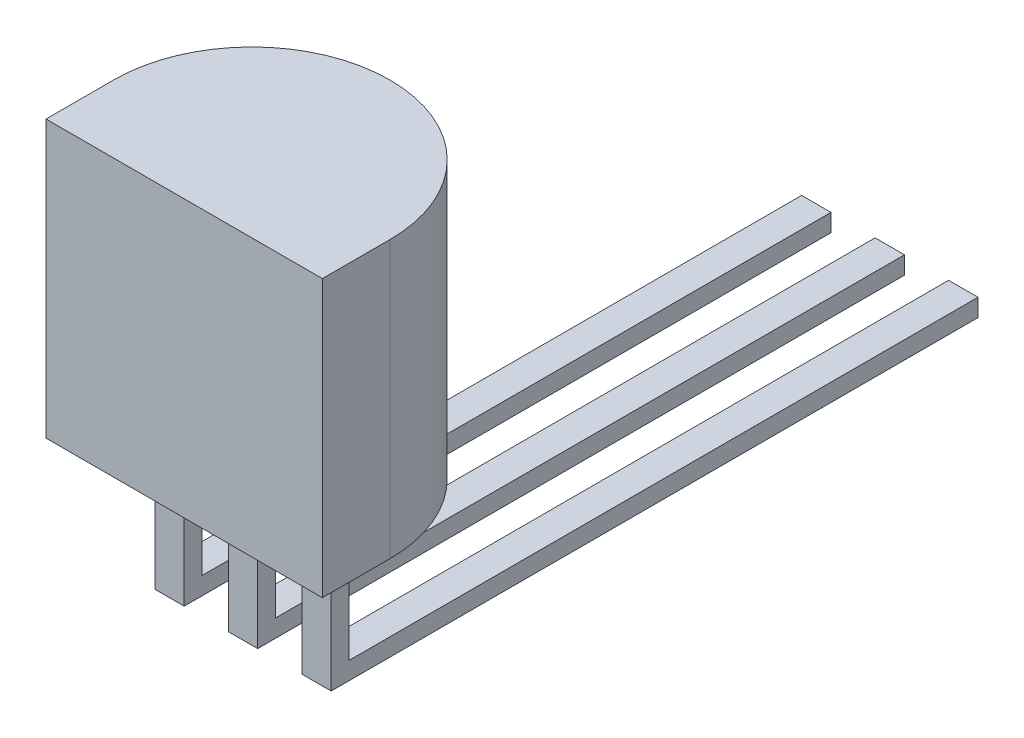
ISO-10303-21;
HEADER;
FILE_DESCRIPTION(('STEP AP214'),'2;1');
FILE_NAME('part.step','',(''),(''),'','','');
FILE_SCHEMA(('AUTOMOTIVE_DESIGN { 1 0 10303 214 1 1 1 1 }'));
ENDSEC;
DATA;
#1=APPLICATION_CONTEXT('core data for automotive mechanical design processes');
#2=APPLICATION_PROTOCOL_DEFINITION('international standard','automotive_design',2000,#1);
#3=PRODUCT_CONTEXT('',#1,'mechanical');
#4=PRODUCT('Part','Part','',(#3));
#5=PRODUCT_RELATED_PRODUCT_CATEGORY('part','',(#4));
#6=PRODUCT_DEFINITION_FORMATION('','',#4);
#7=PRODUCT_DEFINITION_CONTEXT('part definition',#1,'design');
#8=PRODUCT_DEFINITION('design','',#6,#7);
#9=PRODUCT_DEFINITION_SHAPE('','',#8);
#10=(LENGTH_UNIT() NAMED_UNIT(*) SI_UNIT(.MILLI.,.METRE.));
#11=(NAMED_UNIT(*) PLANE_ANGLE_UNIT() SI_UNIT($,.RADIAN.));
#12=(NAMED_UNIT(*) SI_UNIT($,.STERADIAN.) SOLID_ANGLE_UNIT());
#13=UNCERTAINTY_MEASURE_WITH_UNIT(LENGTH_MEASURE(1.E-05),#10,'distance_accuracy_value','');
#14=(GEOMETRIC_REPRESENTATION_CONTEXT(3) GLOBAL_UNCERTAINTY_ASSIGNED_CONTEXT((#13)) GLOBAL_UNIT_ASSIGNED_CONTEXT((#10,
#11,#12)) REPRESENTATION_CONTEXT('',''));
#15=CARTESIAN_POINT('',(0.,0.,0.));
#16=DIRECTION('',(0.,0.,1.));
#17=DIRECTION('',(1.,0.,0.));
#18=AXIS2_PLACEMENT_3D('',#15,#16,#17);
#19=CARTESIAN_POINT('',(0.,0.,-1.15));
#20=DIRECTION('',(0.,1.,0.));
#21=DIRECTION('',(0.,0.,1.));
#22=AXIS2_PLACEMENT_3D('',#19,#20,#21);
#23=PLANE('',#22);
#24=DIRECTION('',(-1.,0.,0.));
#25=VECTOR('',#24,1.);
#26=CARTESIAN_POINT('',(-0.999999999999999,0.,-1.));
#27=LINE('',#26,#25);
#28=CARTESIAN_POINT('',(-0.999999999999999,0.,-1.));
#29=VERTEX_POINT('',#28);
#30=CARTESIAN_POINT('',(-1.5,0.,-1.));
#31=VERTEX_POINT('',#30);
#32=EDGE_CURVE('E293',#29,#31,#27,.T.);
#33=ORIENTED_EDGE('',*,*,#32,.F.);
#34=DIRECTION('',(0.,0.,1.));
#35=VECTOR('',#34,1.);
#36=CARTESIAN_POINT('',(-0.999999999999999,0.,-1.));
#37=LINE('',#36,#35);
#38=CARTESIAN_POINT('',(-0.999999999999999,0.,-1.3));
#39=VERTEX_POINT('',#38);
#40=EDGE_CURVE('E318',#39,#29,#37,.T.);
#41=ORIENTED_EDGE('',*,*,#40,.F.);
#42=DIRECTION('',(1.,0.,0.));
#43=VECTOR('',#42,1.);
#44=CARTESIAN_POINT('',(-0.999999999999999,0.,-1.3));
#45=LINE('',#44,#43);
#46=CARTESIAN_POINT('',(-1.5,0.,-1.3));
#47=VERTEX_POINT('',#46);
#48=EDGE_CURVE('E326',#47,#39,#45,.T.);
#49=ORIENTED_EDGE('',*,*,#48,.F.);
#50=DIRECTION('',(0.,0.,-1.));
#51=VECTOR('',#50,1.);
#52=CARTESIAN_POINT('',(-1.5,0.,-1.));
#53=LINE('',#52,#51);
#54=EDGE_CURVE('E297',#31,#47,#53,.T.);
#55=ORIENTED_EDGE('',*,*,#54,.F.);
#56=EDGE_LOOP('',(#33,#41,#49,#55));
#57=FACE_BOUND('',#56,.T.);
#58=DIRECTION('',(0.,0.,1.));
#59=VECTOR('',#58,1.);
#60=CARTESIAN_POINT('',(-2.35,0.,0.));
#61=LINE('',#60,#59);
#62=CARTESIAN_POINT('',(-2.35,0.,-1.15));
#63=VERTEX_POINT('',#62);
#64=CARTESIAN_POINT('',(-2.35,0.,0.));
#65=VERTEX_POINT('',#64);
#66=EDGE_CURVE('E351',#63,#65,#61,.T.);
#67=ORIENTED_EDGE('',*,*,#66,.F.);
#68=CARTESIAN_POINT('',(0.,0.,-1.15));
#69=DIRECTION('',(0.,1.,0.));
#70=DIRECTION('',(0.,0.,1.));
#71=AXIS2_PLACEMENT_3D('',#68,#69,#70);
#72=CIRCLE('',#71,2.35);
#73=CARTESIAN_POINT('',(2.35,0.,-1.15));
#74=VERTEX_POINT('',#73);
#75=EDGE_CURVE('E466',#74,#63,#72,.T.);
#76=ORIENTED_EDGE('',*,*,#75,.F.);
#77=DIRECTION('',(0.,0.,-1.));
#78=VECTOR('',#77,1.);
#79=CARTESIAN_POINT('',(2.35,0.,0.));
#80=LINE('',#79,#78);
#81=CARTESIAN_POINT('',(2.35,0.,0.));
#82=VERTEX_POINT('',#81);
#83=EDGE_CURVE('E459',#82,#74,#80,.T.);
#84=ORIENTED_EDGE('',*,*,#83,.F.);
#85=DIRECTION('',(1.,0.,0.));
#86=VECTOR('',#85,1.);
#87=CARTESIAN_POINT('',(-2.35,0.,0.));
#88=LINE('',#87,#86);
#89=EDGE_CURVE('E454',#65,#82,#88,.T.);
#90=ORIENTED_EDGE('',*,*,#89,.F.);
#91=EDGE_LOOP('',(#67,#76,#84,#90));
#92=FACE_BOUND('',#91,.T.);
#93=DIRECTION('',(0.,0.,-1.));
#94=VECTOR('',#93,1.);
#95=CARTESIAN_POINT('',(-0.25,0.,-1.));
#96=LINE('',#95,#94);
#97=CARTESIAN_POINT('',(-0.25,0.,-1.));
#98=VERTEX_POINT('',#97);
#99=CARTESIAN_POINT('',(-0.25,0.,-1.3));
#100=VERTEX_POINT('',#99);
#101=EDGE_CURVE('E335',#98,#100,#96,.T.);
#102=ORIENTED_EDGE('',*,*,#101,.F.);
#103=DIRECTION('',(-1.,0.,0.));
#104=VECTOR('',#103,1.);
#105=CARTESIAN_POINT('',(-0.25,0.,-1.));
#106=LINE('',#105,#104);
#107=CARTESIAN_POINT('',(0.25,0.,-1.));
#108=VERTEX_POINT('',#107);
#109=EDGE_CURVE('E345',#108,#98,#106,.T.);
#110=ORIENTED_EDGE('',*,*,#109,.F.);
#111=DIRECTION('',(0.,0.,1.));
#112=VECTOR('',#111,1.);
#113=CARTESIAN_POINT('',(0.25,0.,-1.));
#114=LINE('',#113,#112);
#115=CARTESIAN_POINT('',(0.250000000000001,0.,-1.3));
#116=VERTEX_POINT('',#115);
#117=EDGE_CURVE('E495',#116,#108,#114,.T.);
#118=ORIENTED_EDGE('',*,*,#117,.F.);
#119=DIRECTION('',(1.,0.,0.));
#120=VECTOR('',#119,1.);
#121=CARTESIAN_POINT('',(-0.25,0.,-1.3));
#122=LINE('',#121,#120);
#123=EDGE_CURVE('E496',#100,#116,#122,.T.);
#124=ORIENTED_EDGE('',*,*,#123,.F.);
#125=EDGE_LOOP('',(#102,#110,#118,#124));
#126=FACE_BOUND('',#125,.T.);
#127=DIRECTION('',(0.,0.,-1.));
#128=VECTOR('',#127,1.);
#129=CARTESIAN_POINT('',(1.,0.,-1.));
#130=LINE('',#129,#128);
#131=CARTESIAN_POINT('',(1.,0.,-1.));
#132=VERTEX_POINT('',#131);
#133=CARTESIAN_POINT('',(1.,0.,-1.3));
#134=VERTEX_POINT('',#133);
#135=EDGE_CURVE('E278',#132,#134,#130,.T.);
#136=ORIENTED_EDGE('',*,*,#135,.F.);
#137=DIRECTION('',(-1.,0.,0.));
#138=VECTOR('',#137,1.);
#139=CARTESIAN_POINT('',(1.,0.,-1.));
#140=LINE('',#139,#138);
#141=CARTESIAN_POINT('',(1.5,0.,-1.));
#142=VERTEX_POINT('',#141);
#143=EDGE_CURVE('E289',#142,#132,#140,.T.);
#144=ORIENTED_EDGE('',*,*,#143,.F.);
#145=DIRECTION('',(0.,0.,1.));
#146=VECTOR('',#145,1.);
#147=CARTESIAN_POINT('',(1.5,0.,-1.));
#148=LINE('',#147,#146);
#149=CARTESIAN_POINT('',(1.5,0.,-1.3));
#150=VERTEX_POINT('',#149);
#151=EDGE_CURVE('E57',#150,#142,#148,.T.);
#152=ORIENTED_EDGE('',*,*,#151,.F.);
#153=DIRECTION('',(1.,0.,0.));
#154=VECTOR('',#153,1.);
#155=CARTESIAN_POINT('',(1.,0.,-1.3));
#156=LINE('',#155,#154);
#157=EDGE_CURVE('E52',#134,#150,#156,.T.);
#158=ORIENTED_EDGE('',*,*,#157,.F.);
#159=EDGE_LOOP('',(#136,#144,#152,#158));
#160=FACE_BOUND('',#159,.T.);
#161=ADVANCED_FACE('F35',(#57,#92,#126,#160),#23,.F.);
#162=CARTESIAN_POINT('',(-2.35,4.7,0.));
#163=DIRECTION('',(1.,0.,0.));
#164=DIRECTION('',(0.,0.,-1.));
#165=AXIS2_PLACEMENT_3D('',#162,#163,#164);
#166=PLANE('',#165);
#167=ORIENTED_EDGE('',*,*,#66,.T.);
#168=DIRECTION('',(0.,-1.,0.));
#169=VECTOR('',#168,1.);
#170=CARTESIAN_POINT('',(-2.35,4.7,0.));
#171=LINE('',#170,#169);
#172=CARTESIAN_POINT('',(-2.35,4.7,0.));
#173=VERTEX_POINT('',#172);
#174=EDGE_CURVE('E11',#173,#65,#171,.T.);
#175=ORIENTED_EDGE('',*,*,#174,.F.);
#176=DIRECTION('',(0.,0.,1.));
#177=VECTOR('',#176,1.);
#178=CARTESIAN_POINT('',(-2.35,4.7,0.));
#179=LINE('',#178,#177);
#180=CARTESIAN_POINT('',(-2.35,4.7,-1.15));
#181=VERTEX_POINT('',#180);
#182=EDGE_CURVE('E468',#181,#173,#179,.T.);
#183=ORIENTED_EDGE('',*,*,#182,.F.);
#184=DIRECTION('',(0.,-1.,0.));
#185=VECTOR('',#184,1.);
#186=CARTESIAN_POINT('',(-2.35,4.7,-1.15));
#187=LINE('',#186,#185);
#188=EDGE_CURVE('E472',#181,#63,#187,.T.);
#189=ORIENTED_EDGE('',*,*,#188,.T.);
#190=EDGE_LOOP('',(#167,#175,#183,#189));
#191=FACE_BOUND('',#190,.T.);
#192=ADVANCED_FACE('F37',(#191),#166,.F.);
#193=CARTESIAN_POINT('',(-2.35,4.7,0.));
#194=DIRECTION('',(0.,0.,-1.));
#195=DIRECTION('',(-1.,0.,0.));
#196=AXIS2_PLACEMENT_3D('',#193,#194,#195);
#197=PLANE('',#196);
#198=ORIENTED_EDGE('',*,*,#89,.T.);
#199=DIRECTION('',(0.,-1.,0.));
#200=VECTOR('',#199,1.);
#201=CARTESIAN_POINT('',(2.35,4.7,0.));
#202=LINE('',#201,#200);
#203=CARTESIAN_POINT('',(2.35,4.7,0.));
#204=VERTEX_POINT('',#203);
#205=EDGE_CURVE('E44',#204,#82,#202,.T.);
#206=ORIENTED_EDGE('',*,*,#205,.F.);
#207=DIRECTION('',(1.,0.,0.));
#208=VECTOR('',#207,1.);
#209=CARTESIAN_POINT('',(-2.35,4.7,0.));
#210=LINE('',#209,#208);
#211=EDGE_CURVE('E488',#173,#204,#210,.T.);
#212=ORIENTED_EDGE('',*,*,#211,.F.);
#213=ORIENTED_EDGE('',*,*,#174,.T.);
#214=EDGE_LOOP('',(#198,#206,#212,#213));
#215=FACE_BOUND('',#214,.T.);
#216=ADVANCED_FACE('F445',(#215),#197,.F.);
#217=CARTESIAN_POINT('',(2.35,4.7,0.));
#218=DIRECTION('',(-1.,0.,0.));
#219=DIRECTION('',(0.,0.,1.));
#220=AXIS2_PLACEMENT_3D('',#217,#218,#219);
#221=PLANE('',#220);
#222=ORIENTED_EDGE('',*,*,#83,.T.);
#223=DIRECTION('',(0.,-1.,0.));
#224=VECTOR('',#223,1.);
#225=CARTESIAN_POINT('',(2.35,4.7,-1.15));
#226=LINE('',#225,#224);
#227=CARTESIAN_POINT('',(2.35,4.7,-1.15));
#228=VERTEX_POINT('',#227);
#229=EDGE_CURVE('E464',#228,#74,#226,.T.);
#230=ORIENTED_EDGE('',*,*,#229,.F.);
#231=DIRECTION('',(0.,0.,-1.));
#232=VECTOR('',#231,1.);
#233=CARTESIAN_POINT('',(2.35,4.7,0.));
#234=LINE('',#233,#232);
#235=EDGE_CURVE('E463',#204,#228,#234,.T.);
#236=ORIENTED_EDGE('',*,*,#235,.F.);
#237=ORIENTED_EDGE('',*,*,#205,.T.);
#238=EDGE_LOOP('',(#222,#230,#236,#237));
#239=FACE_BOUND('',#238,.T.);
#240=ADVANCED_FACE('F442',(#239),#221,.F.);
#241=CARTESIAN_POINT('',(0.,4.7,-1.15));
#242=DIRECTION('',(0.,-1.,0.));
#243=DIRECTION('',(0.,0.,-1.));
#244=AXIS2_PLACEMENT_3D('',#241,#242,#243);
#245=CYLINDRICAL_SURFACE('',#244,2.35);
#246=ORIENTED_EDGE('',*,*,#75,.T.);
#247=ORIENTED_EDGE('',*,*,#188,.F.);
#248=CARTESIAN_POINT('',(0.,4.7,-1.15));
#249=DIRECTION('',(0.,1.,0.));
#250=DIRECTION('',(0.,0.,1.));
#251=AXIS2_PLACEMENT_3D('',#248,#249,#250);
#252=CIRCLE('',#251,2.35);
#253=EDGE_CURVE('E475',#228,#181,#252,.T.);
#254=ORIENTED_EDGE('',*,*,#253,.F.);
#255=ORIENTED_EDGE('',*,*,#229,.T.);
#256=EDGE_LOOP('',(#246,#247,#254,#255));
#257=FACE_BOUND('',#256,.T.);
#258=ADVANCED_FACE('F437',(#257),#245,.T.);
#259=CARTESIAN_POINT('',(0.,4.7,-1.15));
#260=DIRECTION('',(0.,1.,0.));
#261=DIRECTION('',(0.,0.,1.));
#262=AXIS2_PLACEMENT_3D('',#259,#260,#261);
#263=PLANE('',#262);
#264=ORIENTED_EDGE('',*,*,#182,.T.);
#265=ORIENTED_EDGE('',*,*,#211,.T.);
#266=ORIENTED_EDGE('',*,*,#235,.T.);
#267=ORIENTED_EDGE('',*,*,#253,.T.);
#268=EDGE_LOOP('',(#264,#265,#266,#267));
#269=FACE_BOUND('',#268,.T.);
#270=ADVANCED_FACE('F434',(#269),#263,.T.);
#271=CARTESIAN_POINT('',(-0.25,-2.,-1.));
#272=DIRECTION('',(1.,0.,0.));
#273=DIRECTION('',(0.,0.,-1.));
#274=AXIS2_PLACEMENT_3D('',#271,#272,#273);
#275=PLANE('',#274);
#276=ORIENTED_EDGE('',*,*,#101,.T.);
#277=DIRECTION('',(0.,1.,0.));
#278=VECTOR('',#277,1.);
#279=CARTESIAN_POINT('',(-0.25,-2.,-1.3));
#280=LINE('',#279,#278);
#281=CARTESIAN_POINT('',(-0.25,-2.,-1.3));
#282=VERTEX_POINT('',#281);
#283=EDGE_CURVE('E348',#282,#100,#280,.T.);
#284=ORIENTED_EDGE('',*,*,#283,.F.);
#285=DIRECTION('',(0.,0.,1.));
#286=VECTOR('',#285,1.);
#287=CARTESIAN_POINT('',(-0.25,-2.,-12.));
#288=LINE('',#287,#286);
#289=CARTESIAN_POINT('',(-0.25,-2.,-12.));
#290=VERTEX_POINT('',#289);
#291=EDGE_CURVE('E274',#290,#282,#288,.T.);
#292=ORIENTED_EDGE('',*,*,#291,.F.);
#293=DIRECTION('',(0.,-1.,0.));
#294=VECTOR('',#293,1.);
#295=CARTESIAN_POINT('',(-0.25,-2.,-12.));
#296=LINE('',#295,#294);
#297=CARTESIAN_POINT('',(-0.25,-2.3,-12.));
#298=VERTEX_POINT('',#297);
#299=EDGE_CURVE('E254',#290,#298,#296,.T.);
#300=ORIENTED_EDGE('',*,*,#299,.T.);
#301=DIRECTION('',(0.,0.,1.));
#302=VECTOR('',#301,1.);
#303=CARTESIAN_POINT('',(-0.25,-2.3,-12.));
#304=LINE('',#303,#302);
#305=CARTESIAN_POINT('',(-0.25,-2.3,-1.));
#306=VERTEX_POINT('',#305);
#307=EDGE_CURVE('E266',#298,#306,#304,.T.);
#308=ORIENTED_EDGE('',*,*,#307,.T.);
#309=DIRECTION('',(0.,1.,0.));
#310=VECTOR('',#309,1.);
#311=CARTESIAN_POINT('',(-0.25,-2.,-1.));
#312=LINE('',#311,#310);
#313=EDGE_CURVE('E344',#306,#98,#312,.T.);
#314=ORIENTED_EDGE('',*,*,#313,.T.);
#315=EDGE_LOOP('',(#276,#284,#292,#300,#308,#314));
#316=FACE_BOUND('',#315,.T.);
#317=ADVANCED_FACE('F430',(#316),#275,.F.);
#318=CARTESIAN_POINT('',(-0.25,-2.,-1.3));
#319=DIRECTION('',(0.,0.,1.));
#320=DIRECTION('',(1.,0.,0.));
#321=AXIS2_PLACEMENT_3D('',#318,#319,#320);
#322=PLANE('',#321);
#323=ORIENTED_EDGE('',*,*,#123,.T.);
#324=DIRECTION('',(0.,1.,0.));
#325=VECTOR('',#324,1.);
#326=CARTESIAN_POINT('',(0.250000000000001,-2.,-1.3));
#327=LINE('',#326,#325);
#328=CARTESIAN_POINT('',(0.25,-2.,-1.3));
#329=VERTEX_POINT('',#328);
#330=EDGE_CURVE('E352',#329,#116,#327,.T.);
#331=ORIENTED_EDGE('',*,*,#330,.F.);
#332=DIRECTION('',(1.,0.,0.));
#333=VECTOR('',#332,1.);
#334=CARTESIAN_POINT('',(-0.25,-2.,-1.3));
#335=LINE('',#334,#333);
#336=EDGE_CURVE('E340',#282,#329,#335,.T.);
#337=ORIENTED_EDGE('',*,*,#336,.F.);
#338=ORIENTED_EDGE('',*,*,#283,.T.);
#339=EDGE_LOOP('',(#323,#331,#337,#338));
#340=FACE_BOUND('',#339,.T.);
#341=ADVANCED_FACE('F426',(#340),#322,.F.);
#342=CARTESIAN_POINT('',(0.25,-2.,-1.));
#343=DIRECTION('',(-1.,0.,0.));
#344=DIRECTION('',(0.,0.,1.));
#345=AXIS2_PLACEMENT_3D('',#342,#343,#344);
#346=PLANE('',#345);
#347=ORIENTED_EDGE('',*,*,#117,.T.);
#348=DIRECTION('',(0.,1.,0.));
#349=VECTOR('',#348,1.);
#350=CARTESIAN_POINT('',(0.25,-2.,-1.));
#351=LINE('',#350,#349);
#352=CARTESIAN_POINT('',(0.25,-2.3,-1.));
#353=VERTEX_POINT('',#352);
#354=EDGE_CURVE('E477',#353,#108,#351,.T.);
#355=ORIENTED_EDGE('',*,*,#354,.F.);
#356=DIRECTION('',(0.,0.,1.));
#357=VECTOR('',#356,1.);
#358=CARTESIAN_POINT('',(0.25,-2.3,-12.));
#359=LINE('',#358,#357);
#360=CARTESIAN_POINT('',(0.25,-2.3,-12.));
#361=VERTEX_POINT('',#360);
#362=EDGE_CURVE('E502',#361,#353,#359,.T.);
#363=ORIENTED_EDGE('',*,*,#362,.F.);
#364=DIRECTION('',(0.,1.,0.));
#365=VECTOR('',#364,1.);
#366=CARTESIAN_POINT('',(0.25,-2.,-12.));
#367=LINE('',#366,#365);
#368=CARTESIAN_POINT('',(0.25,-2.,-12.));
#369=VERTEX_POINT('',#368);
#370=EDGE_CURVE('E260',#361,#369,#367,.T.);
#371=ORIENTED_EDGE('',*,*,#370,.T.);
#372=DIRECTION('',(0.,0.,1.));
#373=VECTOR('',#372,1.);
#374=CARTESIAN_POINT('',(0.25,-2.,-12.));
#375=LINE('',#374,#373);
#376=EDGE_CURVE('E279',#369,#329,#375,.T.);
#377=ORIENTED_EDGE('',*,*,#376,.T.);
#378=ORIENTED_EDGE('',*,*,#330,.T.);
#379=EDGE_LOOP('',(#347,#355,#363,#371,#377,#378));
#380=FACE_BOUND('',#379,.T.);
#381=ADVANCED_FACE('F422',(#380),#346,.F.);
#382=CARTESIAN_POINT('',(-0.25,-2.,-1.));
#383=DIRECTION('',(0.,0.,-1.));
#384=DIRECTION('',(-1.,0.,0.));
#385=AXIS2_PLACEMENT_3D('',#382,#383,#384);
#386=PLANE('',#385);
#387=ORIENTED_EDGE('',*,*,#109,.T.);
#388=ORIENTED_EDGE('',*,*,#313,.F.);
#389=DIRECTION('',(1.,0.,0.));
#390=VECTOR('',#389,1.);
#391=CARTESIAN_POINT('',(-0.25,-2.3,-1.));
#392=LINE('',#391,#390);
#393=EDGE_CURVE('E251',#306,#353,#392,.T.);
#394=ORIENTED_EDGE('',*,*,#393,.T.);
#395=ORIENTED_EDGE('',*,*,#354,.T.);
#396=EDGE_LOOP('',(#387,#388,#394,#395));
#397=FACE_BOUND('',#396,.T.);
#398=ADVANCED_FACE('F419',(#397),#386,.F.);
#399=CARTESIAN_POINT('',(-0.999999999999999,-2.,-1.));
#400=DIRECTION('',(0.,0.,-1.));
#401=DIRECTION('',(-1.,0.,0.));
#402=AXIS2_PLACEMENT_3D('',#399,#400,#401);
#403=PLANE('',#402);
#404=ORIENTED_EDGE('',*,*,#32,.T.);
#405=DIRECTION('',(0.,1.,0.));
#406=VECTOR('',#405,1.);
#407=CARTESIAN_POINT('',(-1.5,-2.,-1.));
#408=LINE('',#407,#406);
#409=CARTESIAN_POINT('',(-1.5,-2.3,-1.));
#410=VERTEX_POINT('',#409);
#411=EDGE_CURVE('E311',#410,#31,#408,.T.);
#412=ORIENTED_EDGE('',*,*,#411,.F.);
#413=DIRECTION('',(1.,0.,0.));
#414=VECTOR('',#413,1.);
#415=CARTESIAN_POINT('',(-1.5,-2.3,-1.));
#416=LINE('',#415,#414);
#417=CARTESIAN_POINT('',(-0.999999999999999,-2.3,-1.));
#418=VERTEX_POINT('',#417);
#419=EDGE_CURVE('E225',#410,#418,#416,.T.);
#420=ORIENTED_EDGE('',*,*,#419,.T.);
#421=DIRECTION('',(0.,1.,0.));
#422=VECTOR('',#421,1.);
#423=CARTESIAN_POINT('',(-0.999999999999999,-2.,-1.));
#424=LINE('',#423,#422);
#425=EDGE_CURVE('E317',#418,#29,#424,.T.);
#426=ORIENTED_EDGE('',*,*,#425,.T.);
#427=EDGE_LOOP('',(#404,#412,#420,#426));
#428=FACE_BOUND('',#427,.T.);
#429=ADVANCED_FACE('F378',(#428),#403,.F.);
#430=CARTESIAN_POINT('',(-1.5,-2.,-1.));
#431=DIRECTION('',(1.,0.,0.));
#432=DIRECTION('',(0.,0.,-1.));
#433=AXIS2_PLACEMENT_3D('',#430,#431,#432);
#434=PLANE('',#433);
#435=ORIENTED_EDGE('',*,*,#54,.T.);
#436=DIRECTION('',(0.,1.,0.));
#437=VECTOR('',#436,1.);
#438=CARTESIAN_POINT('',(-1.5,-2.,-1.3));
#439=LINE('',#438,#437);
#440=CARTESIAN_POINT('',(-1.5,-2.,-1.3));
#441=VERTEX_POINT('',#440);
#442=EDGE_CURVE('E308',#441,#47,#439,.T.);
#443=ORIENTED_EDGE('',*,*,#442,.F.);
#444=DIRECTION('',(0.,0.,1.));
#445=VECTOR('',#444,1.);
#446=CARTESIAN_POINT('',(-1.5,-2.,-12.));
#447=LINE('',#446,#445);
#448=CARTESIAN_POINT('',(-1.5,-2.,-12.));
#449=VERTEX_POINT('',#448);
#450=EDGE_CURVE('E247',#449,#441,#447,.T.);
#451=ORIENTED_EDGE('',*,*,#450,.F.);
#452=DIRECTION('',(0.,-1.,0.));
#453=VECTOR('',#452,1.);
#454=CARTESIAN_POINT('',(-1.5,-2.,-12.));
#455=LINE('',#454,#453);
#456=CARTESIAN_POINT('',(-1.5,-2.3,-12.));
#457=VERTEX_POINT('',#456);
#458=EDGE_CURVE('E227',#449,#457,#455,.T.);
#459=ORIENTED_EDGE('',*,*,#458,.T.);
#460=DIRECTION('',(0.,0.,1.));
#461=VECTOR('',#460,1.);
#462=CARTESIAN_POINT('',(-1.5,-2.3,-12.));
#463=LINE('',#462,#461);
#464=EDGE_CURVE('E239',#457,#410,#463,.T.);
#465=ORIENTED_EDGE('',*,*,#464,.T.);
#466=ORIENTED_EDGE('',*,*,#411,.T.);
#467=EDGE_LOOP('',(#435,#443,#451,#459,#465,#466));
#468=FACE_BOUND('',#467,.T.);
#469=ADVANCED_FACE('F366',(#468),#434,.F.);
#470=CARTESIAN_POINT('',(-0.999999999999999,-2.,-1.3));
#471=DIRECTION('',(0.,0.,1.));
#472=DIRECTION('',(1.,0.,0.));
#473=AXIS2_PLACEMENT_3D('',#470,#471,#472);
#474=PLANE('',#473);
#475=ORIENTED_EDGE('',*,*,#48,.T.);
#476=DIRECTION('',(0.,1.,0.));
#477=VECTOR('',#476,1.);
#478=CARTESIAN_POINT('',(-0.999999999999999,-2.,-1.3));
#479=LINE('',#478,#477);
#480=CARTESIAN_POINT('',(-0.999999999999999,-2.,-1.3));
#481=VERTEX_POINT('',#480);
#482=EDGE_CURVE('E312',#481,#39,#479,.T.);
#483=ORIENTED_EDGE('',*,*,#482,.F.);
#484=DIRECTION('',(1.,0.,0.));
#485=VECTOR('',#484,1.);
#486=CARTESIAN_POINT('',(-0.999999999999999,-2.,-1.3));
#487=LINE('',#486,#485);
#488=EDGE_CURVE('E313',#441,#481,#487,.T.);
#489=ORIENTED_EDGE('',*,*,#488,.F.);
#490=ORIENTED_EDGE('',*,*,#442,.T.);
#491=EDGE_LOOP('',(#475,#483,#489,#490));
#492=FACE_BOUND('',#491,.T.);
#493=ADVANCED_FACE('F360',(#492),#474,.F.);
#494=CARTESIAN_POINT('',(-0.999999999999999,-2.,-1.));
#495=DIRECTION('',(-1.,0.,0.));
#496=DIRECTION('',(0.,0.,1.));
#497=AXIS2_PLACEMENT_3D('',#494,#495,#496);
#498=PLANE('',#497);
#499=ORIENTED_EDGE('',*,*,#40,.T.);
#500=ORIENTED_EDGE('',*,*,#425,.F.);
#501=DIRECTION('',(0.,0.,1.));
#502=VECTOR('',#501,1.);
#503=CARTESIAN_POINT('',(-0.999999999999999,-2.3,-12.));
#504=LINE('',#503,#502);
#505=CARTESIAN_POINT('',(-0.999999999999999,-2.3,-12.));
#506=VERTEX_POINT('',#505);
#507=EDGE_CURVE('E376',#506,#418,#504,.T.);
#508=ORIENTED_EDGE('',*,*,#507,.F.);
#509=DIRECTION('',(0.,1.,0.));
#510=VECTOR('',#509,1.);
#511=CARTESIAN_POINT('',(-0.999999999999999,-2.,-12.));
#512=LINE('',#511,#510);
#513=CARTESIAN_POINT('',(-0.999999999999999,-2.,-12.));
#514=VERTEX_POINT('',#513);
#515=EDGE_CURVE('E233',#506,#514,#512,.T.);
#516=ORIENTED_EDGE('',*,*,#515,.T.);
#517=DIRECTION('',(0.,0.,1.));
#518=VECTOR('',#517,1.);
#519=CARTESIAN_POINT('',(-0.999999999999999,-2.,-12.));
#520=LINE('',#519,#518);
#521=EDGE_CURVE('E252',#514,#481,#520,.T.);
#522=ORIENTED_EDGE('',*,*,#521,.T.);
#523=ORIENTED_EDGE('',*,*,#482,.T.);
#524=EDGE_LOOP('',(#499,#500,#508,#516,#522,#523));
#525=FACE_BOUND('',#524,.T.);
#526=ADVANCED_FACE('F357',(#525),#498,.F.);
#527=CARTESIAN_POINT('',(1.,-2.,-1.));
#528=DIRECTION('',(1.,0.,0.));
#529=DIRECTION('',(0.,0.,-1.));
#530=AXIS2_PLACEMENT_3D('',#527,#528,#529);
#531=PLANE('',#530);
#532=ORIENTED_EDGE('',*,*,#135,.T.);
#533=DIRECTION('',(0.,1.,0.));
#534=VECTOR('',#533,1.);
#535=CARTESIAN_POINT('',(1.,-2.,-1.3));
#536=LINE('',#535,#534);
#537=CARTESIAN_POINT('',(1.,-2.,-1.3));
#538=VERTEX_POINT('',#537);
#539=EDGE_CURVE('E292',#538,#134,#536,.T.);
#540=ORIENTED_EDGE('',*,*,#539,.F.);
#541=DIRECTION('',(0.,0.,1.));
#542=VECTOR('',#541,1.);
#543=CARTESIAN_POINT('',(1.,-2.,-12.));
#544=LINE('',#543,#542);
#545=CARTESIAN_POINT('',(1.,-2.,-12.));
#546=VERTEX_POINT('',#545);
#547=EDGE_CURVE('E212',#546,#538,#544,.T.);
#548=ORIENTED_EDGE('',*,*,#547,.F.);
#549=DIRECTION('',(0.,-1.,0.));
#550=VECTOR('',#549,1.);
#551=CARTESIAN_POINT('',(1.,-2.,-12.));
#552=LINE('',#551,#550);
#553=CARTESIAN_POINT('',(1.,-2.3,-12.));
#554=VERTEX_POINT('',#553);
#555=EDGE_CURVE('E203',#546,#554,#552,.T.);
#556=ORIENTED_EDGE('',*,*,#555,.T.);
#557=DIRECTION('',(0.,0.,1.));
#558=VECTOR('',#557,1.);
#559=CARTESIAN_POINT('',(1.,-2.3,-12.));
#560=LINE('',#559,#558);
#561=CARTESIAN_POINT('',(1.,-2.3,-1.));
#562=VERTEX_POINT('',#561);
#563=EDGE_CURVE('E185',#554,#562,#560,.T.);
#564=ORIENTED_EDGE('',*,*,#563,.T.);
#565=DIRECTION('',(0.,1.,0.));
#566=VECTOR('',#565,1.);
#567=CARTESIAN_POINT('',(1.,-2.,-1.));
#568=LINE('',#567,#566);
#569=EDGE_CURVE('E288',#562,#132,#568,.T.);
#570=ORIENTED_EDGE('',*,*,#569,.T.);
#571=EDGE_LOOP('',(#532,#540,#548,#556,#564,#570));
#572=FACE_BOUND('',#571,.T.);
#573=ADVANCED_FACE('F209',(#572),#531,.F.);
#574=CARTESIAN_POINT('',(1.,-2.,-1.3));
#575=DIRECTION('',(0.,0.,1.));
#576=DIRECTION('',(1.,0.,0.));
#577=AXIS2_PLACEMENT_3D('',#574,#575,#576);
#578=PLANE('',#577);
#579=ORIENTED_EDGE('',*,*,#157,.T.);
#580=DIRECTION('',(0.,1.,0.));
#581=VECTOR('',#580,1.);
#582=CARTESIAN_POINT('',(1.5,-2.,-1.3));
#583=LINE('',#582,#581);
#584=CARTESIAN_POINT('',(1.5,-2.,-1.3));
#585=VERTEX_POINT('',#584);
#586=EDGE_CURVE('E294',#585,#150,#583,.T.);
#587=ORIENTED_EDGE('',*,*,#586,.F.);
#588=DIRECTION('',(1.,0.,0.));
#589=VECTOR('',#588,1.);
#590=CARTESIAN_POINT('',(1.,-2.,-1.3));
#591=LINE('',#590,#589);
#592=EDGE_CURVE('E285',#538,#585,#591,.T.);
#593=ORIENTED_EDGE('',*,*,#592,.F.);
#594=ORIENTED_EDGE('',*,*,#539,.T.);
#595=EDGE_LOOP('',(#579,#587,#593,#594));
#596=FACE_BOUND('',#595,.T.);
#597=ADVANCED_FACE('F394',(#596),#578,.F.);
#598=CARTESIAN_POINT('',(1.5,-2.,-1.));
#599=DIRECTION('',(-1.,0.,0.));
#600=DIRECTION('',(0.,0.,1.));
#601=AXIS2_PLACEMENT_3D('',#598,#599,#600);
#602=PLANE('',#601);
#603=ORIENTED_EDGE('',*,*,#151,.T.);
#604=DIRECTION('',(0.,1.,0.));
#605=VECTOR('',#604,1.);
#606=CARTESIAN_POINT('',(1.5,-2.,-1.));
#607=LINE('',#606,#605);
#608=CARTESIAN_POINT('',(1.5,-2.3,-1.));
#609=VERTEX_POINT('',#608);
#610=EDGE_CURVE('E300',#609,#142,#607,.T.);
#611=ORIENTED_EDGE('',*,*,#610,.F.);
#612=DIRECTION('',(0.,0.,1.));
#613=VECTOR('',#612,1.);
#614=CARTESIAN_POINT('',(1.5,-2.3,-12.));
#615=LINE('',#614,#613);
#616=CARTESIAN_POINT('',(1.5,-2.3,-12.));
#617=VERTEX_POINT('',#616);
#618=EDGE_CURVE('E195',#617,#609,#615,.T.);
#619=ORIENTED_EDGE('',*,*,#618,.F.);
#620=DIRECTION('',(0.,1.,0.));
#621=VECTOR('',#620,1.);
#622=CARTESIAN_POINT('',(1.5,-2.,-12.));
#623=LINE('',#622,#621);
#624=CARTESIAN_POINT('',(1.5,-2.,-12.));
#625=VERTEX_POINT('',#624);
#626=EDGE_CURVE('E206',#617,#625,#623,.T.);
#627=ORIENTED_EDGE('',*,*,#626,.T.);
#628=DIRECTION('',(0.,0.,1.));
#629=VECTOR('',#628,1.);
#630=CARTESIAN_POINT('',(1.5,-2.,-12.));
#631=LINE('',#630,#629);
#632=EDGE_CURVE('E226',#625,#585,#631,.T.);
#633=ORIENTED_EDGE('',*,*,#632,.T.);
#634=ORIENTED_EDGE('',*,*,#586,.T.);
#635=EDGE_LOOP('',(#603,#611,#619,#627,#633,#634));
#636=FACE_BOUND('',#635,.T.);
#637=ADVANCED_FACE('F397',(#636),#602,.F.);
#638=CARTESIAN_POINT('',(1.,-2.,-1.));
#639=DIRECTION('',(0.,0.,-1.));
#640=DIRECTION('',(-1.,0.,0.));
#641=AXIS2_PLACEMENT_3D('',#638,#639,#640);
#642=PLANE('',#641);
#643=ORIENTED_EDGE('',*,*,#143,.T.);
#644=ORIENTED_EDGE('',*,*,#569,.F.);
#645=DIRECTION('',(1.,0.,0.));
#646=VECTOR('',#645,1.);
#647=CARTESIAN_POINT('',(1.,-2.3,-1.));
#648=LINE('',#647,#646);
#649=EDGE_CURVE('E191',#562,#609,#648,.T.);
#650=ORIENTED_EDGE('',*,*,#649,.T.);
#651=ORIENTED_EDGE('',*,*,#610,.T.);
#652=EDGE_LOOP('',(#643,#644,#650,#651));
#653=FACE_BOUND('',#652,.T.);
#654=ADVANCED_FACE('F391',(#653),#642,.F.);
#655=CARTESIAN_POINT('',(-0.25,-2.,-12.));
#656=DIRECTION('',(0.,1.,0.));
#657=DIRECTION('',(0.,0.,1.));
#658=AXIS2_PLACEMENT_3D('',#655,#656,#657);
#659=PLANE('',#658);
#660=ORIENTED_EDGE('',*,*,#291,.T.);
#661=ORIENTED_EDGE('',*,*,#336,.T.);
#662=ORIENTED_EDGE('',*,*,#376,.F.);
#663=DIRECTION('',(-1.,0.,0.));
#664=VECTOR('',#663,1.);
#665=CARTESIAN_POINT('',(-0.25,-2.,-12.));
#666=LINE('',#665,#664);
#667=EDGE_CURVE('E263',#369,#290,#666,.T.);
#668=ORIENTED_EDGE('',*,*,#667,.T.);
#669=EDGE_LOOP('',(#660,#661,#662,#668));
#670=FACE_BOUND('',#669,.T.);
#671=ADVANCED_FACE('F404',(#670),#659,.T.);
#672=CARTESIAN_POINT('',(-0.25,-2.3,-12.));
#673=DIRECTION('',(0.,-1.,0.));
#674=DIRECTION('',(0.,0.,-1.));
#675=AXIS2_PLACEMENT_3D('',#672,#673,#674);
#676=PLANE('',#675);
#677=ORIENTED_EDGE('',*,*,#393,.F.);
#678=ORIENTED_EDGE('',*,*,#307,.F.);
#679=DIRECTION('',(1.,0.,0.));
#680=VECTOR('',#679,1.);
#681=CARTESIAN_POINT('',(-0.25,-2.3,-12.));
#682=LINE('',#681,#680);
#683=EDGE_CURVE('E257',#298,#361,#682,.T.);
#684=ORIENTED_EDGE('',*,*,#683,.T.);
#685=ORIENTED_EDGE('',*,*,#362,.T.);
#686=EDGE_LOOP('',(#677,#678,#684,#685));
#687=FACE_BOUND('',#686,.T.);
#688=ADVANCED_FACE('F505',(#687),#676,.T.);
#689=CARTESIAN_POINT('',(0.,0.,-12.));
#690=DIRECTION('',(0.,0.,1.));
#691=DIRECTION('',(1.,0.,0.));
#692=AXIS2_PLACEMENT_3D('',#689,#690,#691);
#693=PLANE('',#692);
#694=ORIENTED_EDGE('',*,*,#299,.F.);
#695=ORIENTED_EDGE('',*,*,#667,.F.);
#696=ORIENTED_EDGE('',*,*,#370,.F.);
#697=ORIENTED_EDGE('',*,*,#683,.F.);
#698=EDGE_LOOP('',(#694,#695,#696,#697));
#699=FACE_BOUND('',#698,.T.);
#700=ADVANCED_FACE('F511',(#699),#693,.F.);
#701=CARTESIAN_POINT('',(-1.5,-2.,-12.));
#702=DIRECTION('',(0.,1.,0.));
#703=DIRECTION('',(0.,0.,1.));
#704=AXIS2_PLACEMENT_3D('',#701,#702,#703);
#705=PLANE('',#704);
#706=ORIENTED_EDGE('',*,*,#450,.T.);
#707=ORIENTED_EDGE('',*,*,#488,.T.);
#708=ORIENTED_EDGE('',*,*,#521,.F.);
#709=DIRECTION('',(-1.,0.,0.));
#710=VECTOR('',#709,1.);
#711=CARTESIAN_POINT('',(-1.5,-2.,-12.));
#712=LINE('',#711,#710);
#713=EDGE_CURVE('E236',#514,#449,#712,.T.);
#714=ORIENTED_EDGE('',*,*,#713,.T.);
#715=EDGE_LOOP('',(#706,#707,#708,#714));
#716=FACE_BOUND('',#715,.T.);
#717=ADVANCED_FACE('F362',(#716),#705,.T.);
#718=CARTESIAN_POINT('',(-1.5,-2.3,-12.));
#719=DIRECTION('',(0.,-1.,0.));
#720=DIRECTION('',(0.,0.,-1.));
#721=AXIS2_PLACEMENT_3D('',#718,#719,#720);
#722=PLANE('',#721);
#723=ORIENTED_EDGE('',*,*,#419,.F.);
#724=ORIENTED_EDGE('',*,*,#464,.F.);
#725=DIRECTION('',(1.,0.,0.));
#726=VECTOR('',#725,1.);
#727=CARTESIAN_POINT('',(-1.5,-2.3,-12.));
#728=LINE('',#727,#726);
#729=EDGE_CURVE('E230',#457,#506,#728,.T.);
#730=ORIENTED_EDGE('',*,*,#729,.T.);
#731=ORIENTED_EDGE('',*,*,#507,.T.);
#732=EDGE_LOOP('',(#723,#724,#730,#731));
#733=FACE_BOUND('',#732,.T.);
#734=ADVANCED_FACE('F375',(#733),#722,.T.);
#735=CARTESIAN_POINT('',(0.,0.,-12.));
#736=DIRECTION('',(0.,0.,1.));
#737=DIRECTION('',(1.,0.,0.));
#738=AXIS2_PLACEMENT_3D('',#735,#736,#737);
#739=PLANE('',#738);
#740=ORIENTED_EDGE('',*,*,#458,.F.);
#741=ORIENTED_EDGE('',*,*,#713,.F.);
#742=ORIENTED_EDGE('',*,*,#515,.F.);
#743=ORIENTED_EDGE('',*,*,#729,.F.);
#744=EDGE_LOOP('',(#740,#741,#742,#743));
#745=FACE_BOUND('',#744,.T.);
#746=ADVANCED_FACE('F370',(#745),#739,.F.);
#747=CARTESIAN_POINT('',(1.,-2.,-12.));
#748=DIRECTION('',(0.,1.,0.));
#749=DIRECTION('',(0.,0.,1.));
#750=AXIS2_PLACEMENT_3D('',#747,#748,#749);
#751=PLANE('',#750);
#752=ORIENTED_EDGE('',*,*,#547,.T.);
#753=ORIENTED_EDGE('',*,*,#592,.T.);
#754=ORIENTED_EDGE('',*,*,#632,.F.);
#755=DIRECTION('',(-1.,0.,0.));
#756=VECTOR('',#755,1.);
#757=CARTESIAN_POINT('',(1.,-2.,-12.));
#758=LINE('',#757,#756);
#759=EDGE_CURVE('E196',#625,#546,#758,.T.);
#760=ORIENTED_EDGE('',*,*,#759,.T.);
#761=EDGE_LOOP('',(#752,#753,#754,#760));
#762=FACE_BOUND('',#761,.T.);
#763=ADVANCED_FACE('F396',(#762),#751,.T.);
#764=CARTESIAN_POINT('',(1.,-2.3,-12.));
#765=DIRECTION('',(0.,-1.,0.));
#766=DIRECTION('',(0.,0.,-1.));
#767=AXIS2_PLACEMENT_3D('',#764,#765,#766);
#768=PLANE('',#767);
#769=ORIENTED_EDGE('',*,*,#649,.F.);
#770=ORIENTED_EDGE('',*,*,#563,.F.);
#771=DIRECTION('',(1.,0.,0.));
#772=VECTOR('',#771,1.);
#773=CARTESIAN_POINT('',(1.,-2.3,-12.));
#774=LINE('',#773,#772);
#775=EDGE_CURVE('E189',#554,#617,#774,.T.);
#776=ORIENTED_EDGE('',*,*,#775,.T.);
#777=ORIENTED_EDGE('',*,*,#618,.T.);
#778=EDGE_LOOP('',(#769,#770,#776,#777));
#779=FACE_BOUND('',#778,.T.);
#780=ADVANCED_FACE('F187',(#779),#768,.T.);
#781=CARTESIAN_POINT('',(0.,0.,-12.));
#782=DIRECTION('',(0.,0.,1.));
#783=DIRECTION('',(1.,0.,0.));
#784=AXIS2_PLACEMENT_3D('',#781,#782,#783);
#785=PLANE('',#784);
#786=ORIENTED_EDGE('',*,*,#555,.F.);
#787=ORIENTED_EDGE('',*,*,#759,.F.);
#788=ORIENTED_EDGE('',*,*,#626,.F.);
#789=ORIENTED_EDGE('',*,*,#775,.F.);
#790=EDGE_LOOP('',(#786,#787,#788,#789));
#791=FACE_BOUND('',#790,.T.);
#792=ADVANCED_FACE('F201',(#791),#785,.F.);
#793=CLOSED_SHELL('',(#161,#192,#216,#240,#258,#270,#317,#341,#381,#398,#429,#469,#493,#526,
#573,#597,#637,#654,#671,#688,#700,#717,#734,#746,#763,#780,#792));
#794=MANIFOLD_SOLID_BREP('B2',#793);
#795=ADVANCED_BREP_SHAPE_REPRESENTATION('',(#18,#794),#14);
#796=SHAPE_DEFINITION_REPRESENTATION(#9,#795);
ENDSEC;
END-ISO-10303-21;
